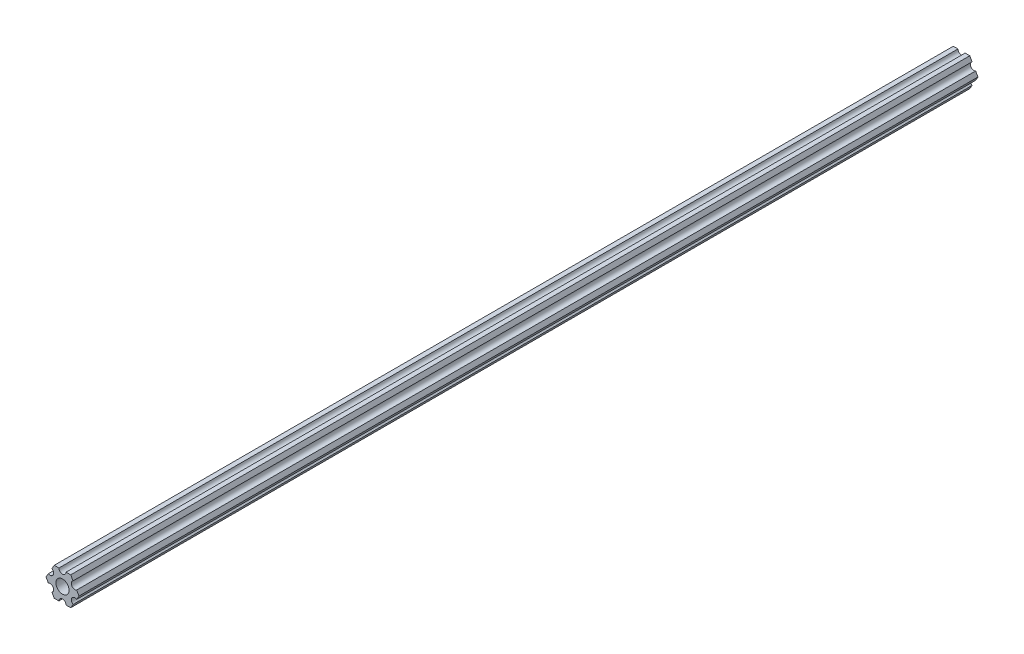
ISO-10303-21;
HEADER;
FILE_DESCRIPTION(('STEP AP214'),'2;1');
FILE_NAME('part.step','',(''),(''),'','','');
FILE_SCHEMA(('AUTOMOTIVE_DESIGN { 1 0 10303 214 1 1 1 1 }'));
ENDSEC;
DATA;
#1=APPLICATION_CONTEXT('core data for automotive mechanical design processes');
#2=APPLICATION_PROTOCOL_DEFINITION('international standard','automotive_design',2000,#1);
#3=PRODUCT_CONTEXT('',#1,'mechanical');
#4=PRODUCT('Part','Part','',(#3));
#5=PRODUCT_RELATED_PRODUCT_CATEGORY('part','',(#4));
#6=PRODUCT_DEFINITION_FORMATION('','',#4);
#7=PRODUCT_DEFINITION_CONTEXT('part definition',#1,'design');
#8=PRODUCT_DEFINITION('design','',#6,#7);
#9=PRODUCT_DEFINITION_SHAPE('','',#8);
#10=(LENGTH_UNIT() NAMED_UNIT(*) SI_UNIT(.MILLI.,.METRE.));
#11=(NAMED_UNIT(*) PLANE_ANGLE_UNIT() SI_UNIT($,.RADIAN.));
#12=(NAMED_UNIT(*) SI_UNIT($,.STERADIAN.) SOLID_ANGLE_UNIT());
#13=UNCERTAINTY_MEASURE_WITH_UNIT(LENGTH_MEASURE(1.E-05),#10,'distance_accuracy_value','');
#14=(GEOMETRIC_REPRESENTATION_CONTEXT(3) GLOBAL_UNCERTAINTY_ASSIGNED_CONTEXT((#13)) GLOBAL_UNIT_ASSIGNED_CONTEXT((#10,
#11,#12)) REPRESENTATION_CONTEXT('',''));
#15=CARTESIAN_POINT('',(0.,0.,0.));
#16=DIRECTION('',(0.,0.,1.));
#17=DIRECTION('',(1.,0.,0.));
#18=AXIS2_PLACEMENT_3D('',#15,#16,#17);
#19=CARTESIAN_POINT('',(5.49926112168156,3.17500033315933,400.05));
#20=DIRECTION('',(0.,0.,1.));
#21=DIRECTION('',(1.,0.,0.));
#22=AXIS2_PLACEMENT_3D('',#19,#20,#21);
#23=PLANE('',#22);
#24=DIRECTION('',(0.499999947533953,0.866025434075723,0.));
#25=VECTOR('',#24,1.);
#26=CARTESIAN_POINT('',(6.29301142309098,-1.80018429024546,400.05));
#27=LINE('',#26,#25);
#28=CARTESIAN_POINT('',(6.29301142309098,-1.80018429024546,400.05));
#29=VERTEX_POINT('',#28);
#30=CARTESIAN_POINT('',(7.33234841870826,4.44212519169686E-07,400.05));
#31=VERTEX_POINT('',#30);
#32=EDGE_CURVE('E227',#29,#31,#27,.T.);
#33=ORIENTED_EDGE('',*,*,#32,.T.);
#34=DIRECTION('',(-0.500000052466056,0.866025373493145,0.));
#35=VECTOR('',#34,1.);
#36=CARTESIAN_POINT('',(7.33234841870826,4.44212519169686E-07,400.05));
#37=LINE('',#36,#35);
#38=CARTESIAN_POINT('',(6.29301120497139,1.80018505273894,400.05));
#39=VERTEX_POINT('',#38);
#40=EDGE_CURVE('E125',#31,#39,#37,.T.);
#41=ORIENTED_EDGE('',*,*,#40,.T.);
#42=CARTESIAN_POINT('',(5.49926112168156,3.17500033315933,400.05));
#43=DIRECTION('',(0.,0.,-1.));
#44=DIRECTION('',(1.,0.,0.));
#45=AXIS2_PLACEMENT_3D('',#42,#43,#44);
#46=CIRCLE('',#45,1.5875);
#47=CARTESIAN_POINT('',(4.70551103839172,4.54981561357972,400.05));
#48=VERTEX_POINT('',#47);
#49=EDGE_CURVE('E272',#39,#48,#46,.T.);
#50=ORIENTED_EDGE('',*,*,#49,.T.);
#51=DIRECTION('',(-0.500000052466046,0.866025373493151,0.));
#52=VECTOR('',#51,1.);
#53=CARTESIAN_POINT('',(4.70551103839172,4.54981561357972,400.05));
#54=LINE('',#53,#52);
#55=CARTESIAN_POINT('',(3.66617382465481,6.35000022210627,400.05));
#56=VERTEX_POINT('',#55);
#57=EDGE_CURVE('E291',#48,#56,#54,.T.);
#58=ORIENTED_EDGE('',*,*,#57,.T.);
#59=DIRECTION('',(-0.999999999999998,-6.05825850611185E-08,0.));
#60=VECTOR('',#59,1.);
#61=CARTESIAN_POINT('',(3.66617382465481,6.35000022210627,400.05));
#62=LINE('',#61,#60);
#63=CARTESIAN_POINT('',(1.58749961530074,6.35000009617482,400.05));
#64=VERTEX_POINT('',#63);
#65=EDGE_CURVE('E288',#56,#64,#62,.T.);
#66=ORIENTED_EDGE('',*,*,#65,.T.);
#67=CARTESIAN_POINT('',(-3.84699260060323E-07,6.35,400.05));
#68=DIRECTION('',(0.,0.,-1.));
#69=DIRECTION('',(1.,0.,0.));
#70=AXIS2_PLACEMENT_3D('',#67,#68,#69);
#71=CIRCLE('',#70,1.5875);
#72=CARTESIAN_POINT('',(-1.58750038469926,6.34999990382518,400.05));
#73=VERTEX_POINT('',#72);
#74=EDGE_CURVE('E290',#64,#73,#71,.T.);
#75=ORIENTED_EDGE('',*,*,#74,.T.);
#76=DIRECTION('',(-0.999999999999998,-6.05825963273174E-08,0.));
#77=VECTOR('',#76,1.);
#78=CARTESIAN_POINT('',(-1.58750038469926,6.34999990382518,400.05));
#79=LINE('',#78,#77);
#80=CARTESIAN_POINT('',(-3.66617459405349,6.3499997778937,400.05));
#81=VERTEX_POINT('',#80);
#82=EDGE_CURVE('E293',#73,#81,#79,.T.);
#83=ORIENTED_EDGE('',*,*,#82,.T.);
#84=DIRECTION('',(-0.499999947533942,-0.866025434075729,0.));
#85=VECTOR('',#84,1.);
#86=CARTESIAN_POINT('',(-3.66617459405349,6.3499997778937,400.05));
#87=LINE('',#86,#85);
#88=CARTESIAN_POINT('',(-4.70551158967065,4.54981504343587,400.05));
#89=VERTEX_POINT('',#88);
#90=EDGE_CURVE('E299',#81,#89,#87,.T.);
#91=ORIENTED_EDGE('',*,*,#90,.T.);
#92=CARTESIAN_POINT('',(-5.49926150638082,3.17499966684067,400.05));
#93=DIRECTION('',(0.,0.,-1.));
#94=DIRECTION('',(1.,0.,0.));
#95=AXIS2_PLACEMENT_3D('',#92,#93,#94);
#96=CIRCLE('',#95,1.5875);
#97=CARTESIAN_POINT('',(-6.29301142309098,1.80018429024547,400.05));
#98=VERTEX_POINT('',#97);
#99=EDGE_CURVE('E301',#89,#98,#96,.T.);
#100=ORIENTED_EDGE('',*,*,#99,.T.);
#101=DIRECTION('',(-0.499999947533951,-0.866025434075724,0.));
#102=VECTOR('',#101,1.);
#103=CARTESIAN_POINT('',(-6.29301142309098,1.80018429024547,400.05));
#104=LINE('',#103,#102);
#105=CARTESIAN_POINT('',(-7.33234841870826,-4.44212523790841E-07,400.05));
#106=VERTEX_POINT('',#105);
#107=EDGE_CURVE('E303',#98,#106,#104,.T.);
#108=ORIENTED_EDGE('',*,*,#107,.T.);
#109=DIRECTION('',(0.500000052466045,-0.866025373493151,0.));
#110=VECTOR('',#109,1.);
#111=CARTESIAN_POINT('',(-7.33234841870826,-4.44212523790841E-07,400.05));
#112=LINE('',#111,#110);
#113=CARTESIAN_POINT('',(-6.29301120497141,-1.80018505273897,400.05));
#114=VERTEX_POINT('',#113);
#115=EDGE_CURVE('E305',#106,#114,#112,.T.);
#116=ORIENTED_EDGE('',*,*,#115,.T.);
#117=CARTESIAN_POINT('',(-5.49926112168156,-3.17500033315934,400.05));
#118=DIRECTION('',(0.,0.,-1.));
#119=DIRECTION('',(1.,0.,0.));
#120=AXIS2_PLACEMENT_3D('',#117,#118,#119);
#121=CIRCLE('',#120,1.5875);
#122=CARTESIAN_POINT('',(-4.70551103839172,-4.54981561357972,400.05));
#123=VERTEX_POINT('',#122);
#124=EDGE_CURVE('E307',#114,#123,#121,.T.);
#125=ORIENTED_EDGE('',*,*,#124,.T.);
#126=DIRECTION('',(0.500000052466045,-0.866025373493151,0.));
#127=VECTOR('',#126,1.);
#128=CARTESIAN_POINT('',(-4.70551103839172,-4.54981561357972,400.05));
#129=LINE('',#128,#127);
#130=CARTESIAN_POINT('',(-3.66617382465481,-6.35000022210628,400.05));
#131=VERTEX_POINT('',#130);
#132=EDGE_CURVE('E309',#123,#131,#129,.T.);
#133=ORIENTED_EDGE('',*,*,#132,.T.);
#134=DIRECTION('',(0.999999999999998,6.05825854783851E-08,0.));
#135=VECTOR('',#134,1.);
#136=CARTESIAN_POINT('',(-3.66617382465481,-6.35000022210628,400.05));
#137=LINE('',#136,#135);
#138=CARTESIAN_POINT('',(-1.58749961530074,-6.35000009617482,400.05));
#139=VERTEX_POINT('',#138);
#140=EDGE_CURVE('E311',#131,#139,#137,.T.);
#141=ORIENTED_EDGE('',*,*,#140,.T.);
#142=CARTESIAN_POINT('',(3.8469926204343E-07,-6.35,400.05));
#143=DIRECTION('',(0.,0.,-1.));
#144=DIRECTION('',(1.,0.,0.));
#145=AXIS2_PLACEMENT_3D('',#142,#143,#144);
#146=CIRCLE('',#145,1.5875);
#147=CARTESIAN_POINT('',(1.58750038469926,-6.34999990382518,400.05));
#148=VERTEX_POINT('',#147);
#149=EDGE_CURVE('E174',#139,#148,#146,.T.);
#150=ORIENTED_EDGE('',*,*,#149,.T.);
#151=DIRECTION('',(0.999999999999998,6.05825721258438E-08,0.));
#152=VECTOR('',#151,1.);
#153=CARTESIAN_POINT('',(1.58750038469926,-6.34999990382518,400.05));
#154=LINE('',#153,#152);
#155=CARTESIAN_POINT('',(3.66617459405346,-6.34999977789375,400.05));
#156=VERTEX_POINT('',#155);
#157=EDGE_CURVE('E168',#148,#156,#154,.T.);
#158=ORIENTED_EDGE('',*,*,#157,.T.);
#159=DIRECTION('',(0.499999947533941,0.86602543407573,0.));
#160=VECTOR('',#159,1.);
#161=CARTESIAN_POINT('',(3.66617459405346,-6.34999977789375,400.05));
#162=LINE('',#161,#160);
#163=CARTESIAN_POINT('',(4.70551158967065,-4.54981504343587,400.05));
#164=VERTEX_POINT('',#163);
#165=EDGE_CURVE('E172',#156,#164,#162,.T.);
#166=ORIENTED_EDGE('',*,*,#165,.T.);
#167=CARTESIAN_POINT('',(5.49926150638082,-3.17499966684067,400.05));
#168=DIRECTION('',(0.,0.,-1.));
#169=DIRECTION('',(1.,0.,0.));
#170=AXIS2_PLACEMENT_3D('',#167,#168,#169);
#171=CIRCLE('',#170,1.58750000000001);
#172=EDGE_CURVE('E52',#164,#29,#171,.T.);
#173=ORIENTED_EDGE('',*,*,#172,.T.);
#174=EDGE_LOOP('',(#33,#41,#50,#58,#66,#75,#83,#91,#100,#108,#116,#125,#133,#141,#150,#158,#166,#173));
#175=FACE_BOUND('',#174,.T.);
#176=CARTESIAN_POINT('',(0.,0.,400.05));
#177=DIRECTION('',(0.,0.,1.));
#178=DIRECTION('',(1.,0.,0.));
#179=AXIS2_PLACEMENT_3D('',#176,#177,#178);
#180=CIRCLE('',#179,2.9337);
#181=CARTESIAN_POINT('',(-2.9337,0.,400.05));
#182=VERTEX_POINT('',#181);
#183=EDGE_CURVE('E196',#182,#182,#180,.T.);
#184=ORIENTED_EDGE('',*,*,#183,.F.);
#185=EDGE_LOOP('',(#184));
#186=FACE_BOUND('',#185,.T.);
#187=ADVANCED_FACE('F35',(#175,#186),#23,.T.);
#188=CARTESIAN_POINT('',(5.49926112168156,3.17500033315933,0.));
#189=DIRECTION('',(0.,0.,1.));
#190=DIRECTION('',(1.,0.,0.));
#191=AXIS2_PLACEMENT_3D('',#188,#189,#190);
#192=PLANE('',#191);
#193=DIRECTION('',(0.499999947533953,0.866025434075723,0.));
#194=VECTOR('',#193,1.);
#195=CARTESIAN_POINT('',(6.29301142309098,-1.80018429024546,0.));
#196=LINE('',#195,#194);
#197=CARTESIAN_POINT('',(6.29301142309098,-1.80018429024546,0.));
#198=VERTEX_POINT('',#197);
#199=CARTESIAN_POINT('',(7.33234841870826,4.44212519169686E-07,0.));
#200=VERTEX_POINT('',#199);
#201=EDGE_CURVE('E192',#198,#200,#196,.T.);
#202=ORIENTED_EDGE('',*,*,#201,.F.);
#203=CARTESIAN_POINT('',(5.49926150638082,-3.17499966684067,0.));
#204=DIRECTION('',(0.,0.,-1.));
#205=DIRECTION('',(1.,0.,0.));
#206=AXIS2_PLACEMENT_3D('',#203,#204,#205);
#207=CIRCLE('',#206,1.58750000000001);
#208=CARTESIAN_POINT('',(4.70551158967065,-4.54981504343587,0.));
#209=VERTEX_POINT('',#208);
#210=EDGE_CURVE('E117',#209,#198,#207,.T.);
#211=ORIENTED_EDGE('',*,*,#210,.F.);
#212=DIRECTION('',(0.499999947533941,0.86602543407573,0.));
#213=VECTOR('',#212,1.);
#214=CARTESIAN_POINT('',(3.66617459405346,-6.34999977789375,0.));
#215=LINE('',#214,#213);
#216=CARTESIAN_POINT('',(3.66617459405346,-6.34999977789375,0.));
#217=VERTEX_POINT('',#216);
#218=EDGE_CURVE('E111',#217,#209,#215,.T.);
#219=ORIENTED_EDGE('',*,*,#218,.F.);
#220=DIRECTION('',(0.999999999999998,6.05825721258438E-08,0.));
#221=VECTOR('',#220,1.);
#222=CARTESIAN_POINT('',(1.58750038469926,-6.34999990382518,0.));
#223=LINE('',#222,#221);
#224=CARTESIAN_POINT('',(1.58750038469926,-6.34999990382518,0.));
#225=VERTEX_POINT('',#224);
#226=EDGE_CURVE('E182',#225,#217,#223,.T.);
#227=ORIENTED_EDGE('',*,*,#226,.F.);
#228=CARTESIAN_POINT('',(3.8469926204343E-07,-6.35,0.));
#229=DIRECTION('',(0.,0.,-1.));
#230=DIRECTION('',(1.,0.,0.));
#231=AXIS2_PLACEMENT_3D('',#228,#229,#230);
#232=CIRCLE('',#231,1.5875);
#233=CARTESIAN_POINT('',(-1.58749961530074,-6.35000009617482,0.));
#234=VERTEX_POINT('',#233);
#235=EDGE_CURVE('E222',#234,#225,#232,.T.);
#236=ORIENTED_EDGE('',*,*,#235,.F.);
#237=DIRECTION('',(0.999999999999998,6.05825854783851E-08,0.));
#238=VECTOR('',#237,1.);
#239=CARTESIAN_POINT('',(-3.66617382465481,-6.35000022210628,0.));
#240=LINE('',#239,#238);
#241=CARTESIAN_POINT('',(-3.66617382465481,-6.35000022210628,0.));
#242=VERTEX_POINT('',#241);
#243=EDGE_CURVE('E220',#242,#234,#240,.T.);
#244=ORIENTED_EDGE('',*,*,#243,.F.);
#245=DIRECTION('',(0.500000052466045,-0.866025373493151,0.));
#246=VECTOR('',#245,1.);
#247=CARTESIAN_POINT('',(-4.70551103839172,-4.54981561357972,0.));
#248=LINE('',#247,#246);
#249=CARTESIAN_POINT('',(-4.70551103839172,-4.54981561357972,0.));
#250=VERTEX_POINT('',#249);
#251=EDGE_CURVE('E218',#250,#242,#248,.T.);
#252=ORIENTED_EDGE('',*,*,#251,.F.);
#253=CARTESIAN_POINT('',(-5.49926112168156,-3.17500033315934,0.));
#254=DIRECTION('',(0.,0.,-1.));
#255=DIRECTION('',(1.,0.,0.));
#256=AXIS2_PLACEMENT_3D('',#253,#254,#255);
#257=CIRCLE('',#256,1.5875);
#258=CARTESIAN_POINT('',(-6.29301120497141,-1.80018505273897,0.));
#259=VERTEX_POINT('',#258);
#260=EDGE_CURVE('E216',#259,#250,#257,.T.);
#261=ORIENTED_EDGE('',*,*,#260,.F.);
#262=DIRECTION('',(0.500000052466045,-0.866025373493151,0.));
#263=VECTOR('',#262,1.);
#264=CARTESIAN_POINT('',(-7.33234841870826,-4.44212523790841E-07,0.));
#265=LINE('',#264,#263);
#266=CARTESIAN_POINT('',(-7.33234841870826,-4.44212523790841E-07,0.));
#267=VERTEX_POINT('',#266);
#268=EDGE_CURVE('E214',#267,#259,#265,.T.);
#269=ORIENTED_EDGE('',*,*,#268,.F.);
#270=DIRECTION('',(-0.499999947533951,-0.866025434075724,0.));
#271=VECTOR('',#270,1.);
#272=CARTESIAN_POINT('',(-6.29301142309098,1.80018429024547,0.));
#273=LINE('',#272,#271);
#274=CARTESIAN_POINT('',(-6.29301142309098,1.80018429024547,0.));
#275=VERTEX_POINT('',#274);
#276=EDGE_CURVE('E212',#275,#267,#273,.T.);
#277=ORIENTED_EDGE('',*,*,#276,.F.);
#278=CARTESIAN_POINT('',(-5.49926150638082,3.17499966684067,0.));
#279=DIRECTION('',(0.,0.,-1.));
#280=DIRECTION('',(1.,0.,0.));
#281=AXIS2_PLACEMENT_3D('',#278,#279,#280);
#282=CIRCLE('',#281,1.5875);
#283=CARTESIAN_POINT('',(-4.70551158967065,4.54981504343587,0.));
#284=VERTEX_POINT('',#283);
#285=EDGE_CURVE('E210',#284,#275,#282,.T.);
#286=ORIENTED_EDGE('',*,*,#285,.F.);
#287=DIRECTION('',(-0.499999947533942,-0.866025434075729,0.));
#288=VECTOR('',#287,1.);
#289=CARTESIAN_POINT('',(-3.66617459405349,6.3499997778937,0.));
#290=LINE('',#289,#288);
#291=CARTESIAN_POINT('',(-3.66617459405349,6.3499997778937,0.));
#292=VERTEX_POINT('',#291);
#293=EDGE_CURVE('E208',#292,#284,#290,.T.);
#294=ORIENTED_EDGE('',*,*,#293,.F.);
#295=DIRECTION('',(-0.999999999999998,-6.05825963273174E-08,0.));
#296=VECTOR('',#295,1.);
#297=CARTESIAN_POINT('',(-1.58750038469926,6.34999990382518,0.));
#298=LINE('',#297,#296);
#299=CARTESIAN_POINT('',(-1.58750038469926,6.34999990382518,0.));
#300=VERTEX_POINT('',#299);
#301=EDGE_CURVE('E206',#300,#292,#298,.T.);
#302=ORIENTED_EDGE('',*,*,#301,.F.);
#303=CARTESIAN_POINT('',(-3.84699260060323E-07,6.35,0.));
#304=DIRECTION('',(0.,0.,-1.));
#305=DIRECTION('',(1.,0.,0.));
#306=AXIS2_PLACEMENT_3D('',#303,#304,#305);
#307=CIRCLE('',#306,1.5875);
#308=CARTESIAN_POINT('',(1.58749961530074,6.35000009617482,0.));
#309=VERTEX_POINT('',#308);
#310=EDGE_CURVE('E204',#309,#300,#307,.T.);
#311=ORIENTED_EDGE('',*,*,#310,.F.);
#312=DIRECTION('',(-0.999999999999998,-6.05825850611185E-08,0.));
#313=VECTOR('',#312,1.);
#314=CARTESIAN_POINT('',(3.66617382465481,6.35000022210627,0.));
#315=LINE('',#314,#313);
#316=CARTESIAN_POINT('',(3.66617382465481,6.35000022210627,0.));
#317=VERTEX_POINT('',#316);
#318=EDGE_CURVE('E202',#317,#309,#315,.T.);
#319=ORIENTED_EDGE('',*,*,#318,.F.);
#320=DIRECTION('',(-0.500000052466046,0.866025373493151,0.));
#321=VECTOR('',#320,1.);
#322=CARTESIAN_POINT('',(4.70551103839172,4.54981561357972,0.));
#323=LINE('',#322,#321);
#324=CARTESIAN_POINT('',(4.70551103839172,4.54981561357972,0.));
#325=VERTEX_POINT('',#324);
#326=EDGE_CURVE('E200',#325,#317,#323,.T.);
#327=ORIENTED_EDGE('',*,*,#326,.F.);
#328=CARTESIAN_POINT('',(5.49926112168156,3.17500033315933,0.));
#329=DIRECTION('',(0.,0.,-1.));
#330=DIRECTION('',(1.,0.,0.));
#331=AXIS2_PLACEMENT_3D('',#328,#329,#330);
#332=CIRCLE('',#331,1.5875);
#333=CARTESIAN_POINT('',(6.29301120497139,1.80018505273894,0.));
#334=VERTEX_POINT('',#333);
#335=EDGE_CURVE('E198',#334,#325,#332,.T.);
#336=ORIENTED_EDGE('',*,*,#335,.F.);
#337=DIRECTION('',(-0.500000052466056,0.866025373493145,0.));
#338=VECTOR('',#337,1.);
#339=CARTESIAN_POINT('',(7.33234841870826,4.44212519169686E-07,0.));
#340=LINE('',#339,#338);
#341=EDGE_CURVE('E195',#200,#334,#340,.T.);
#342=ORIENTED_EDGE('',*,*,#341,.F.);
#343=EDGE_LOOP('',(#202,#211,#219,#227,#236,#244,#252,#261,#269,#277,#286,#294,#302,#311,#319,
#327,#336,#342));
#344=FACE_BOUND('',#343,.T.);
#345=CARTESIAN_POINT('',(0.,0.,0.));
#346=DIRECTION('',(0.,0.,1.));
#347=DIRECTION('',(1.,0.,0.));
#348=AXIS2_PLACEMENT_3D('',#345,#346,#347);
#349=CIRCLE('',#348,2.9337);
#350=CARTESIAN_POINT('',(-2.9337,0.,0.));
#351=VERTEX_POINT('',#350);
#352=EDGE_CURVE('E536',#351,#351,#349,.T.);
#353=ORIENTED_EDGE('',*,*,#352,.T.);
#354=EDGE_LOOP('',(#353));
#355=FACE_BOUND('',#354,.T.);
#356=ADVANCED_FACE('F276',(#344,#355),#192,.F.);
#357=CARTESIAN_POINT('',(6.29301142309098,-1.80018429024546,400.05));
#358=DIRECTION('',(-0.866025434075723,0.499999947533953,0.));
#359=DIRECTION('',(-0.499999947533953,-0.866025434075723,0.));
#360=AXIS2_PLACEMENT_3D('',#357,#358,#359);
#361=PLANE('',#360);
#362=ORIENTED_EDGE('',*,*,#201,.T.);
#363=DIRECTION('',(0.,0.,-1.));
#364=VECTOR('',#363,1.);
#365=CARTESIAN_POINT('',(7.33234841870826,4.44212519169686E-07,400.05));
#366=LINE('',#365,#364);
#367=EDGE_CURVE('E11',#31,#200,#366,.T.);
#368=ORIENTED_EDGE('',*,*,#367,.F.);
#369=ORIENTED_EDGE('',*,*,#32,.F.);
#370=DIRECTION('',(0.,0.,-1.));
#371=VECTOR('',#370,1.);
#372=CARTESIAN_POINT('',(6.29301142309098,-1.80018429024546,400.05));
#373=LINE('',#372,#371);
#374=EDGE_CURVE('E188',#29,#198,#373,.T.);
#375=ORIENTED_EDGE('',*,*,#374,.T.);
#376=EDGE_LOOP('',(#362,#368,#369,#375));
#377=FACE_BOUND('',#376,.T.);
#378=ADVANCED_FACE('F37',(#377),#361,.F.);
#379=CARTESIAN_POINT('',(7.33234841870826,4.44212519169686E-07,400.05));
#380=DIRECTION('',(-0.866025373493145,-0.500000052466056,0.));
#381=DIRECTION('',(0.500000052466056,-0.866025373493145,0.));
#382=AXIS2_PLACEMENT_3D('',#379,#380,#381);
#383=PLANE('',#382);
#384=ORIENTED_EDGE('',*,*,#341,.T.);
#385=DIRECTION('',(0.,0.,-1.));
#386=VECTOR('',#385,1.);
#387=CARTESIAN_POINT('',(6.29301120497139,1.80018505273894,400.05));
#388=LINE('',#387,#386);
#389=EDGE_CURVE('E44',#39,#334,#388,.T.);
#390=ORIENTED_EDGE('',*,*,#389,.F.);
#391=ORIENTED_EDGE('',*,*,#40,.F.);
#392=ORIENTED_EDGE('',*,*,#367,.T.);
#393=EDGE_LOOP('',(#384,#390,#391,#392));
#394=FACE_BOUND('',#393,.T.);
#395=ADVANCED_FACE('F345',(#394),#383,.F.);
#396=CARTESIAN_POINT('',(5.49926112168156,3.17500033315933,400.05));
#397=DIRECTION('',(0.,0.,-1.));
#398=DIRECTION('',(-1.,0.,0.));
#399=AXIS2_PLACEMENT_3D('',#396,#397,#398);
#400=CYLINDRICAL_SURFACE('',#399,1.5875);
#401=ORIENTED_EDGE('',*,*,#335,.T.);
#402=DIRECTION('',(0.,0.,-1.));
#403=VECTOR('',#402,1.);
#404=CARTESIAN_POINT('',(4.70551103839172,4.54981561357972,400.05));
#405=LINE('',#404,#403);
#406=EDGE_CURVE('E264',#48,#325,#405,.T.);
#407=ORIENTED_EDGE('',*,*,#406,.F.);
#408=ORIENTED_EDGE('',*,*,#49,.F.);
#409=ORIENTED_EDGE('',*,*,#389,.T.);
#410=EDGE_LOOP('',(#401,#407,#408,#409));
#411=FACE_BOUND('',#410,.T.);
#412=ADVANCED_FACE('F270',(#411),#400,.F.);
#413=CARTESIAN_POINT('',(4.70551103839172,4.54981561357972,400.05));
#414=DIRECTION('',(-0.866025373493151,-0.500000052466046,0.));
#415=DIRECTION('',(0.500000052466046,-0.866025373493151,0.));
#416=AXIS2_PLACEMENT_3D('',#413,#414,#415);
#417=PLANE('',#416);
#418=ORIENTED_EDGE('',*,*,#326,.T.);
#419=DIRECTION('',(0.,0.,-1.));
#420=VECTOR('',#419,1.);
#421=CARTESIAN_POINT('',(3.66617382465481,6.35000022210627,400.05));
#422=LINE('',#421,#420);
#423=EDGE_CURVE('E261',#56,#317,#422,.T.);
#424=ORIENTED_EDGE('',*,*,#423,.F.);
#425=ORIENTED_EDGE('',*,*,#57,.F.);
#426=ORIENTED_EDGE('',*,*,#406,.T.);
#427=EDGE_LOOP('',(#418,#424,#425,#426));
#428=FACE_BOUND('',#427,.T.);
#429=ADVANCED_FACE('F282',(#428),#417,.F.);
#430=CARTESIAN_POINT('',(3.66617382465481,6.35000022210627,400.05));
#431=DIRECTION('',(6.05825850611185E-08,-0.999999999999998,0.));
#432=DIRECTION('',(0.999999999999998,6.05825850611185E-08,0.));
#433=AXIS2_PLACEMENT_3D('',#430,#431,#432);
#434=PLANE('',#433);
#435=ORIENTED_EDGE('',*,*,#318,.T.);
#436=DIRECTION('',(0.,0.,-1.));
#437=VECTOR('',#436,1.);
#438=CARTESIAN_POINT('',(1.58749961530074,6.35000009617482,400.05));
#439=LINE('',#438,#437);
#440=EDGE_CURVE('E258',#64,#309,#439,.T.);
#441=ORIENTED_EDGE('',*,*,#440,.F.);
#442=ORIENTED_EDGE('',*,*,#65,.F.);
#443=ORIENTED_EDGE('',*,*,#423,.T.);
#444=EDGE_LOOP('',(#435,#441,#442,#443));
#445=FACE_BOUND('',#444,.T.);
#446=ADVANCED_FACE('F286',(#445),#434,.F.);
#447=CARTESIAN_POINT('',(-3.84699260060323E-07,6.35,400.05));
#448=DIRECTION('',(0.,0.,-1.));
#449=DIRECTION('',(-1.,0.,0.));
#450=AXIS2_PLACEMENT_3D('',#447,#448,#449);
#451=CYLINDRICAL_SURFACE('',#450,1.5875);
#452=ORIENTED_EDGE('',*,*,#310,.T.);
#453=DIRECTION('',(0.,0.,-1.));
#454=VECTOR('',#453,1.);
#455=CARTESIAN_POINT('',(-1.58750038469926,6.34999990382518,400.05));
#456=LINE('',#455,#454);
#457=EDGE_CURVE('E255',#73,#300,#456,.T.);
#458=ORIENTED_EDGE('',*,*,#457,.F.);
#459=ORIENTED_EDGE('',*,*,#74,.F.);
#460=ORIENTED_EDGE('',*,*,#440,.T.);
#461=EDGE_LOOP('',(#452,#458,#459,#460));
#462=FACE_BOUND('',#461,.T.);
#463=ADVANCED_FACE('F358',(#462),#451,.F.);
#464=CARTESIAN_POINT('',(-1.58750038469926,6.34999990382518,400.05));
#465=DIRECTION('',(6.05825963273174E-08,-0.999999999999998,0.));
#466=DIRECTION('',(0.999999999999998,6.05825963273174E-08,0.));
#467=AXIS2_PLACEMENT_3D('',#464,#465,#466);
#468=PLANE('',#467);
#469=ORIENTED_EDGE('',*,*,#301,.T.);
#470=DIRECTION('',(0.,0.,-1.));
#471=VECTOR('',#470,1.);
#472=CARTESIAN_POINT('',(-3.66617459405349,6.3499997778937,400.05));
#473=LINE('',#472,#471);
#474=EDGE_CURVE('E252',#81,#292,#473,.T.);
#475=ORIENTED_EDGE('',*,*,#474,.F.);
#476=ORIENTED_EDGE('',*,*,#82,.F.);
#477=ORIENTED_EDGE('',*,*,#457,.T.);
#478=EDGE_LOOP('',(#469,#475,#476,#477));
#479=FACE_BOUND('',#478,.T.);
#480=ADVANCED_FACE('F361',(#479),#468,.F.);
#481=CARTESIAN_POINT('',(-3.66617459405349,6.3499997778937,400.05));
#482=DIRECTION('',(0.866025434075729,-0.499999947533942,0.));
#483=DIRECTION('',(0.499999947533943,0.866025434075729,0.));
#484=AXIS2_PLACEMENT_3D('',#481,#482,#483);
#485=PLANE('',#484);
#486=ORIENTED_EDGE('',*,*,#293,.T.);
#487=DIRECTION('',(0.,0.,-1.));
#488=VECTOR('',#487,1.);
#489=CARTESIAN_POINT('',(-4.70551158967065,4.54981504343587,400.05));
#490=LINE('',#489,#488);
#491=EDGE_CURVE('E249',#89,#284,#490,.T.);
#492=ORIENTED_EDGE('',*,*,#491,.F.);
#493=ORIENTED_EDGE('',*,*,#90,.F.);
#494=ORIENTED_EDGE('',*,*,#474,.T.);
#495=EDGE_LOOP('',(#486,#492,#493,#494));
#496=FACE_BOUND('',#495,.T.);
#497=ADVANCED_FACE('F365',(#496),#485,.F.);
#498=CARTESIAN_POINT('',(-5.49926150638082,3.17499966684067,400.05));
#499=DIRECTION('',(0.,0.,-1.));
#500=DIRECTION('',(-1.,0.,0.));
#501=AXIS2_PLACEMENT_3D('',#498,#499,#500);
#502=CYLINDRICAL_SURFACE('',#501,1.5875);
#503=ORIENTED_EDGE('',*,*,#285,.T.);
#504=DIRECTION('',(0.,0.,-1.));
#505=VECTOR('',#504,1.);
#506=CARTESIAN_POINT('',(-6.29301142309098,1.80018429024547,400.05));
#507=LINE('',#506,#505);
#508=EDGE_CURVE('E246',#98,#275,#507,.T.);
#509=ORIENTED_EDGE('',*,*,#508,.F.);
#510=ORIENTED_EDGE('',*,*,#99,.F.);
#511=ORIENTED_EDGE('',*,*,#491,.T.);
#512=EDGE_LOOP('',(#503,#509,#510,#511));
#513=FACE_BOUND('',#512,.T.);
#514=ADVANCED_FACE('F369',(#513),#502,.F.);
#515=CARTESIAN_POINT('',(-6.29301142309098,1.80018429024547,400.05));
#516=DIRECTION('',(0.866025434075724,-0.499999947533951,0.));
#517=DIRECTION('',(0.499999947533951,0.866025434075724,0.));
#518=AXIS2_PLACEMENT_3D('',#515,#516,#517);
#519=PLANE('',#518);
#520=ORIENTED_EDGE('',*,*,#276,.T.);
#521=DIRECTION('',(0.,0.,-1.));
#522=VECTOR('',#521,1.);
#523=CARTESIAN_POINT('',(-7.33234841870826,-4.44212523790841E-07,400.05));
#524=LINE('',#523,#522);
#525=EDGE_CURVE('E243',#106,#267,#524,.T.);
#526=ORIENTED_EDGE('',*,*,#525,.F.);
#527=ORIENTED_EDGE('',*,*,#107,.F.);
#528=ORIENTED_EDGE('',*,*,#508,.T.);
#529=EDGE_LOOP('',(#520,#526,#527,#528));
#530=FACE_BOUND('',#529,.T.);
#531=ADVANCED_FACE('F373',(#530),#519,.F.);
#532=CARTESIAN_POINT('',(-7.33234841870826,-4.44212523790841E-07,400.05));
#533=DIRECTION('',(0.866025373493151,0.500000052466045,0.));
#534=DIRECTION('',(-0.500000052466045,0.866025373493151,0.));
#535=AXIS2_PLACEMENT_3D('',#532,#533,#534);
#536=PLANE('',#535);
#537=ORIENTED_EDGE('',*,*,#268,.T.);
#538=DIRECTION('',(0.,0.,-1.));
#539=VECTOR('',#538,1.);
#540=CARTESIAN_POINT('',(-6.29301120497141,-1.80018505273897,400.05));
#541=LINE('',#540,#539);
#542=EDGE_CURVE('E240',#114,#259,#541,.T.);
#543=ORIENTED_EDGE('',*,*,#542,.F.);
#544=ORIENTED_EDGE('',*,*,#115,.F.);
#545=ORIENTED_EDGE('',*,*,#525,.T.);
#546=EDGE_LOOP('',(#537,#543,#544,#545));
#547=FACE_BOUND('',#546,.T.);
#548=ADVANCED_FACE('F377',(#547),#536,.F.);
#549=CARTESIAN_POINT('',(-5.49926112168156,-3.17500033315934,400.05));
#550=DIRECTION('',(0.,0.,-1.));
#551=DIRECTION('',(-1.,0.,0.));
#552=AXIS2_PLACEMENT_3D('',#549,#550,#551);
#553=CYLINDRICAL_SURFACE('',#552,1.5875);
#554=ORIENTED_EDGE('',*,*,#260,.T.);
#555=DIRECTION('',(0.,0.,-1.));
#556=VECTOR('',#555,1.);
#557=CARTESIAN_POINT('',(-4.70551103839172,-4.54981561357972,400.05));
#558=LINE('',#557,#556);
#559=EDGE_CURVE('E237',#123,#250,#558,.T.);
#560=ORIENTED_EDGE('',*,*,#559,.F.);
#561=ORIENTED_EDGE('',*,*,#124,.F.);
#562=ORIENTED_EDGE('',*,*,#542,.T.);
#563=EDGE_LOOP('',(#554,#560,#561,#562));
#564=FACE_BOUND('',#563,.T.);
#565=ADVANCED_FACE('F381',(#564),#553,.F.);
#566=CARTESIAN_POINT('',(-4.70551103839172,-4.54981561357972,400.05));
#567=DIRECTION('',(0.866025373493151,0.500000052466045,0.));
#568=DIRECTION('',(-0.500000052466045,0.866025373493152,0.));
#569=AXIS2_PLACEMENT_3D('',#566,#567,#568);
#570=PLANE('',#569);
#571=ORIENTED_EDGE('',*,*,#251,.T.);
#572=DIRECTION('',(0.,0.,-1.));
#573=VECTOR('',#572,1.);
#574=CARTESIAN_POINT('',(-3.66617382465481,-6.35000022210628,400.05));
#575=LINE('',#574,#573);
#576=EDGE_CURVE('E234',#131,#242,#575,.T.);
#577=ORIENTED_EDGE('',*,*,#576,.F.);
#578=ORIENTED_EDGE('',*,*,#132,.F.);
#579=ORIENTED_EDGE('',*,*,#559,.T.);
#580=EDGE_LOOP('',(#571,#577,#578,#579));
#581=FACE_BOUND('',#580,.T.);
#582=ADVANCED_FACE('F385',(#581),#570,.F.);
#583=CARTESIAN_POINT('',(-3.66617382465481,-6.35000022210628,400.05));
#584=DIRECTION('',(-6.05825854783851E-08,0.999999999999998,0.));
#585=DIRECTION('',(-0.999999999999998,-6.05825854783851E-08,0.));
#586=AXIS2_PLACEMENT_3D('',#583,#584,#585);
#587=PLANE('',#586);
#588=ORIENTED_EDGE('',*,*,#243,.T.);
#589=DIRECTION('',(0.,0.,-1.));
#590=VECTOR('',#589,1.);
#591=CARTESIAN_POINT('',(-1.58749961530074,-6.35000009617482,400.05));
#592=LINE('',#591,#590);
#593=EDGE_CURVE('E231',#139,#234,#592,.T.);
#594=ORIENTED_EDGE('',*,*,#593,.F.);
#595=ORIENTED_EDGE('',*,*,#140,.F.);
#596=ORIENTED_EDGE('',*,*,#576,.T.);
#597=EDGE_LOOP('',(#588,#594,#595,#596));
#598=FACE_BOUND('',#597,.T.);
#599=ADVANCED_FACE('F317',(#598),#587,.F.);
#600=CARTESIAN_POINT('',(3.8469926204343E-07,-6.35,400.05));
#601=DIRECTION('',(0.,0.,-1.));
#602=DIRECTION('',(-1.,0.,0.));
#603=AXIS2_PLACEMENT_3D('',#600,#601,#602);
#604=CYLINDRICAL_SURFACE('',#603,1.5875);
#605=ORIENTED_EDGE('',*,*,#235,.T.);
#606=DIRECTION('',(0.,0.,-1.));
#607=VECTOR('',#606,1.);
#608=CARTESIAN_POINT('',(1.58750038469926,-6.34999990382518,400.05));
#609=LINE('',#608,#607);
#610=EDGE_CURVE('E183',#148,#225,#609,.T.);
#611=ORIENTED_EDGE('',*,*,#610,.F.);
#612=ORIENTED_EDGE('',*,*,#149,.F.);
#613=ORIENTED_EDGE('',*,*,#593,.T.);
#614=EDGE_LOOP('',(#605,#611,#612,#613));
#615=FACE_BOUND('',#614,.T.);
#616=ADVANCED_FACE('F321',(#615),#604,.F.);
#617=CARTESIAN_POINT('',(1.58750038469926,-6.34999990382518,400.05));
#618=DIRECTION('',(-6.05825721258438E-08,0.999999999999998,0.));
#619=DIRECTION('',(-0.999999999999998,-6.05825721258438E-08,0.));
#620=AXIS2_PLACEMENT_3D('',#617,#618,#619);
#621=PLANE('',#620);
#622=ORIENTED_EDGE('',*,*,#226,.T.);
#623=DIRECTION('',(0.,0.,-1.));
#624=VECTOR('',#623,1.);
#625=CARTESIAN_POINT('',(3.66617459405346,-6.34999977789375,400.05));
#626=LINE('',#625,#624);
#627=EDGE_CURVE('E179',#156,#217,#626,.T.);
#628=ORIENTED_EDGE('',*,*,#627,.F.);
#629=ORIENTED_EDGE('',*,*,#157,.F.);
#630=ORIENTED_EDGE('',*,*,#610,.T.);
#631=EDGE_LOOP('',(#622,#628,#629,#630));
#632=FACE_BOUND('',#631,.T.);
#633=ADVANCED_FACE('F180',(#632),#621,.F.);
#634=CARTESIAN_POINT('',(3.66617459405346,-6.34999977789375,400.05));
#635=DIRECTION('',(-0.86602543407573,0.499999947533941,0.));
#636=DIRECTION('',(-0.499999947533941,-0.86602543407573,0.));
#637=AXIS2_PLACEMENT_3D('',#634,#635,#636);
#638=PLANE('',#637);
#639=ORIENTED_EDGE('',*,*,#218,.T.);
#640=DIRECTION('',(0.,0.,-1.));
#641=VECTOR('',#640,1.);
#642=CARTESIAN_POINT('',(4.70551158967065,-4.54981504343587,400.05));
#643=LINE('',#642,#641);
#644=EDGE_CURVE('E184',#164,#209,#643,.T.);
#645=ORIENTED_EDGE('',*,*,#644,.F.);
#646=ORIENTED_EDGE('',*,*,#165,.F.);
#647=ORIENTED_EDGE('',*,*,#627,.T.);
#648=EDGE_LOOP('',(#639,#645,#646,#647));
#649=FACE_BOUND('',#648,.T.);
#650=ADVANCED_FACE('F186',(#649),#638,.F.);
#651=CARTESIAN_POINT('',(5.49926150638082,-3.17499966684067,400.05));
#652=DIRECTION('',(0.,0.,-1.));
#653=DIRECTION('',(-1.,0.,0.));
#654=AXIS2_PLACEMENT_3D('',#651,#652,#653);
#655=CYLINDRICAL_SURFACE('',#654,1.58750000000001);
#656=ORIENTED_EDGE('',*,*,#210,.T.);
#657=ORIENTED_EDGE('',*,*,#374,.F.);
#658=ORIENTED_EDGE('',*,*,#172,.F.);
#659=ORIENTED_EDGE('',*,*,#644,.T.);
#660=EDGE_LOOP('',(#656,#657,#658,#659));
#661=FACE_BOUND('',#660,.T.);
#662=ADVANCED_FACE('F325',(#661),#655,.F.);
#663=CARTESIAN_POINT('',(0.,0.,400.05));
#664=DIRECTION('',(0.,0.,-1.));
#665=DIRECTION('',(-1.,0.,0.));
#666=AXIS2_PLACEMENT_3D('',#663,#664,#665);
#667=CYLINDRICAL_SURFACE('',#666,2.9337);
#668=CARTESIAN_POINT('',(-2.9337,0.,400.05));
#669=CARTESIAN_POINT('',(-2.9337,0.,395.8828125));
#670=CARTESIAN_POINT('',(-2.9337,0.,391.715625));
#671=CARTESIAN_POINT('',(-2.9337,0.,383.38125));
#672=CARTESIAN_POINT('',(-2.9337,0.,379.2140625));
#673=CARTESIAN_POINT('',(-2.9337,0.,370.8796875));
#674=CARTESIAN_POINT('',(-2.9337,0.,366.7125));
#675=CARTESIAN_POINT('',(-2.9337,0.,358.378125));
#676=CARTESIAN_POINT('',(-2.9337,0.,354.2109375));
#677=CARTESIAN_POINT('',(-2.9337,0.,345.8765625));
#678=CARTESIAN_POINT('',(-2.9337,0.,341.709375));
#679=CARTESIAN_POINT('',(-2.9337,0.,333.375));
#680=CARTESIAN_POINT('',(-2.9337,0.,329.2078125));
#681=CARTESIAN_POINT('',(-2.9337,0.,320.8734375));
#682=CARTESIAN_POINT('',(-2.9337,0.,316.70625));
#683=CARTESIAN_POINT('',(-2.9337,0.,308.371875));
#684=CARTESIAN_POINT('',(-2.9337,0.,304.2046875));
#685=CARTESIAN_POINT('',(-2.9337,0.,295.8703125));
#686=CARTESIAN_POINT('',(-2.9337,0.,291.703125));
#687=CARTESIAN_POINT('',(-2.9337,0.,283.36875));
#688=CARTESIAN_POINT('',(-2.9337,0.,279.2015625));
#689=CARTESIAN_POINT('',(-2.9337,0.,270.8671875));
#690=CARTESIAN_POINT('',(-2.9337,0.,266.7));
#691=CARTESIAN_POINT('',(-2.9337,0.,258.365625));
#692=CARTESIAN_POINT('',(-2.9337,0.,254.1984375));
#693=CARTESIAN_POINT('',(-2.9337,0.,245.8640625));
#694=CARTESIAN_POINT('',(-2.9337,0.,241.696875));
#695=CARTESIAN_POINT('',(-2.9337,0.,233.3625));
#696=CARTESIAN_POINT('',(-2.9337,0.,229.1953125));
#697=CARTESIAN_POINT('',(-2.9337,0.,220.8609375));
#698=CARTESIAN_POINT('',(-2.9337,0.,216.69375));
#699=CARTESIAN_POINT('',(-2.9337,0.,208.359375));
#700=CARTESIAN_POINT('',(-2.9337,0.,204.1921875));
#701=CARTESIAN_POINT('',(-2.9337,0.,195.8578125));
#702=CARTESIAN_POINT('',(-2.9337,0.,191.690625));
#703=CARTESIAN_POINT('',(-2.9337,0.,183.35625));
#704=CARTESIAN_POINT('',(-2.9337,0.,179.1890625));
#705=CARTESIAN_POINT('',(-2.9337,0.,170.8546875));
#706=CARTESIAN_POINT('',(-2.9337,0.,166.6875));
#707=CARTESIAN_POINT('',(-2.9337,0.,158.353125));
#708=CARTESIAN_POINT('',(-2.9337,0.,154.1859375));
#709=CARTESIAN_POINT('',(-2.9337,0.,145.8515625));
#710=CARTESIAN_POINT('',(-2.9337,0.,141.684375));
#711=CARTESIAN_POINT('',(-2.9337,0.,133.35));
#712=CARTESIAN_POINT('',(-2.9337,0.,129.1828125));
#713=CARTESIAN_POINT('',(-2.9337,0.,120.8484375));
#714=CARTESIAN_POINT('',(-2.9337,0.,116.68125));
#715=CARTESIAN_POINT('',(-2.9337,0.,108.346875));
#716=CARTESIAN_POINT('',(-2.9337,0.,104.1796875));
#717=CARTESIAN_POINT('',(-2.9337,0.,95.8453125));
#718=CARTESIAN_POINT('',(-2.9337,0.,91.678125));
#719=CARTESIAN_POINT('',(-2.9337,0.,83.34375));
#720=CARTESIAN_POINT('',(-2.9337,0.,79.1765625));
#721=CARTESIAN_POINT('',(-2.9337,0.,70.8421875));
#722=CARTESIAN_POINT('',(-2.9337,0.,66.675));
#723=CARTESIAN_POINT('',(-2.9337,0.,58.340625));
#724=CARTESIAN_POINT('',(-2.9337,0.,54.1734375));
#725=CARTESIAN_POINT('',(-2.9337,0.,45.8390625));
#726=CARTESIAN_POINT('',(-2.9337,0.,41.671875));
#727=CARTESIAN_POINT('',(-2.9337,0.,33.3375));
#728=CARTESIAN_POINT('',(-2.9337,0.,29.1703125));
#729=CARTESIAN_POINT('',(-2.9337,0.,20.8359375));
#730=CARTESIAN_POINT('',(-2.9337,0.,16.66875));
#731=CARTESIAN_POINT('',(-2.9337,0.,8.334375));
#732=CARTESIAN_POINT('',(-2.9337,0.,4.1671875));
#733=CARTESIAN_POINT('',(-2.9337,0.,0.));
#734=B_SPLINE_CURVE_WITH_KNOTS('',3,(#668,#669,#670,#671,#672,#673,#674,#675,#676,#677,#678,
#679,#680,#681,#682,#683,#684,#685,#686,#687,#688,#689,#690,#691,#692,#693,#694,#695,#696,#697,
#698,#699,#700,#701,#702,#703,#704,#705,#706,#707,#708,#709,#710,#711,#712,#713,#714,#715,#716,
#717,#718,#719,#720,#721,#722,#723,#724,#725,#726,#727,#728,#729,#730,#731,#732,#733),
.UNSPECIFIED.,.F.,.F.,(4,2,2,2,2,2,2,2,2,2,2,2,2,2,2,2,2,2,2,2,2,2,2,2,2,2,2,2,2,2,2,2,4),(0.,
12.5015625,25.003125,37.5046875,50.00625,62.5078124999999,75.0093749999999,87.5109374999999,
100.0125,112.5140625,125.015625,137.5171875,150.01875,162.5203125,175.021875,187.5234375,
200.025,212.5265625,225.028125,237.5296875,250.03125,262.5328125,275.034375,287.5359375,
300.0375,312.5390625,325.040625,337.5421875,350.04375,362.5453125,375.046875,387.5484375,
400.05),.UNSPECIFIED.);
#735=EDGE_CURVE('BSEAM327',#182,#351,#734,.T.);
#736=ORIENTED_EDGE('',*,*,#183,.T.);
#737=ORIENTED_EDGE('',*,*,#352,.F.);
#738=ORIENTED_EDGE('',*,*,#735,.T.);
#739=ORIENTED_EDGE('',*,*,#735,.F.);
#740=EDGE_LOOP('',(#736,#738,#737,#739));
#741=FACE_BOUND('',#740,.T.);
#742=ADVANCED_FACE('F327',(#741),#667,.F.);
#743=CLOSED_SHELL('',(#187,#356,#378,#395,#412,#429,#446,#463,#480,#497,#514,#531,#548,#565,
#582,#599,#616,#633,#650,#662,#742));
#744=MANIFOLD_SOLID_BREP('B2',#743);
#745=ADVANCED_BREP_SHAPE_REPRESENTATION('',(#18,#744),#14);
#746=SHAPE_DEFINITION_REPRESENTATION(#9,#745);
ENDSEC;
END-ISO-10303-21;
